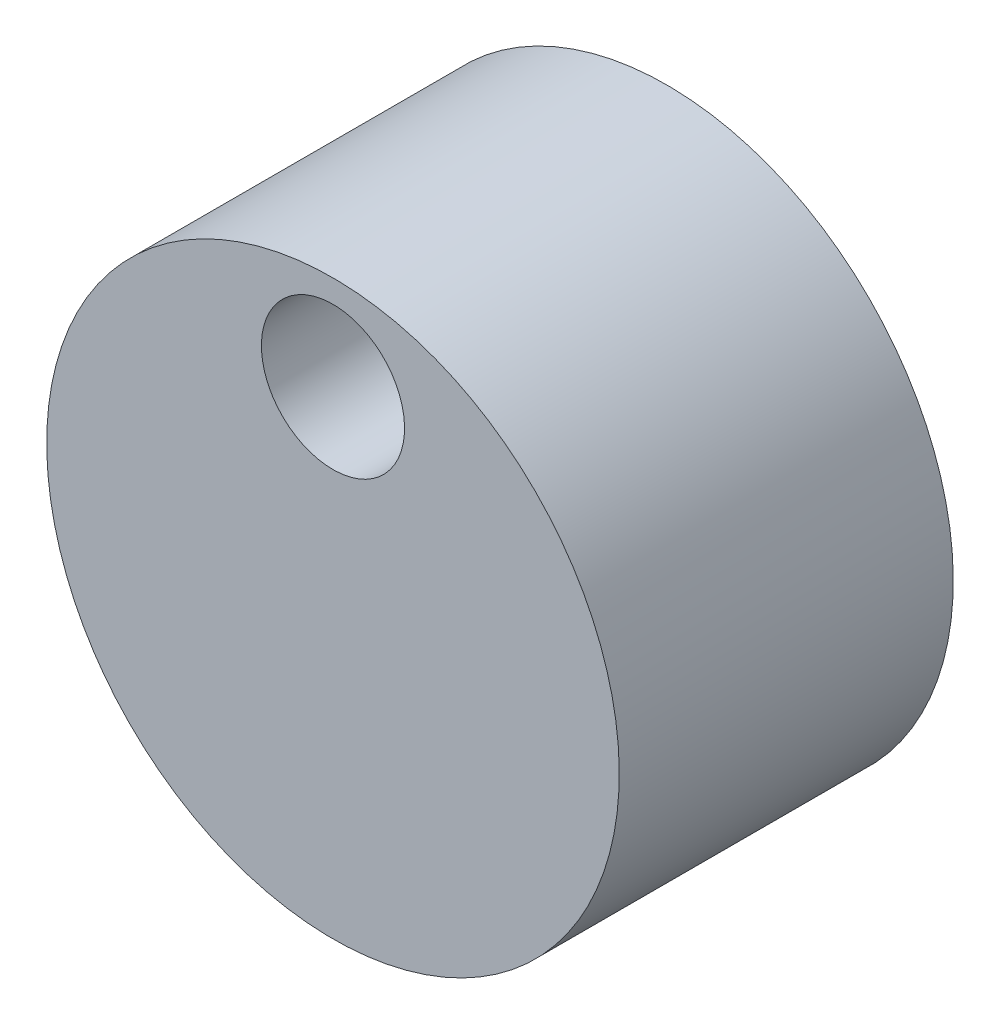
ISO-10303-21;
HEADER;
FILE_DESCRIPTION(('STEP AP214'),'2;1');
FILE_NAME('part.step','',(''),(''),'','','');
FILE_SCHEMA(('AUTOMOTIVE_DESIGN { 1 0 10303 214 1 1 1 1 }'));
ENDSEC;
DATA;
#1=APPLICATION_CONTEXT('core data for automotive mechanical design processes');
#2=APPLICATION_PROTOCOL_DEFINITION('international standard','automotive_design',2000,#1);
#3=PRODUCT_CONTEXT('',#1,'mechanical');
#4=PRODUCT('Part','Part','',(#3));
#5=PRODUCT_RELATED_PRODUCT_CATEGORY('part','',(#4));
#6=PRODUCT_DEFINITION_FORMATION('','',#4);
#7=PRODUCT_DEFINITION_CONTEXT('part definition',#1,'design');
#8=PRODUCT_DEFINITION('design','',#6,#7);
#9=PRODUCT_DEFINITION_SHAPE('','',#8);
#10=(LENGTH_UNIT() NAMED_UNIT(*) SI_UNIT(.MILLI.,.METRE.));
#11=(NAMED_UNIT(*) PLANE_ANGLE_UNIT() SI_UNIT($,.RADIAN.));
#12=(NAMED_UNIT(*) SI_UNIT($,.STERADIAN.) SOLID_ANGLE_UNIT());
#13=UNCERTAINTY_MEASURE_WITH_UNIT(LENGTH_MEASURE(1.E-05),#10,'distance_accuracy_value','');
#14=(GEOMETRIC_REPRESENTATION_CONTEXT(3) GLOBAL_UNCERTAINTY_ASSIGNED_CONTEXT((#13)) GLOBAL_UNIT_ASSIGNED_CONTEXT((#10,
#11,#12)) REPRESENTATION_CONTEXT('',''));
#15=CARTESIAN_POINT('',(0.,0.,0.));
#16=DIRECTION('',(0.,0.,1.));
#17=DIRECTION('',(1.,0.,0.));
#18=AXIS2_PLACEMENT_3D('',#15,#16,#17);
#19=CARTESIAN_POINT('',(0.,0.,14.81582));
#20=DIRECTION('',(0.,0.,1.));
#21=DIRECTION('',(1.,0.,0.));
#22=AXIS2_PLACEMENT_3D('',#19,#20,#21);
#23=PLANE('',#22);
#24=CARTESIAN_POINT('',(0.,0.,14.81582));
#25=DIRECTION('',(0.,0.,1.));
#26=DIRECTION('',(-0.75885671020465,-0.651257624429362,0.));
#27=AXIS2_PLACEMENT_3D('',#24,#25,#26);
#28=ELLIPSE('',#27,12.7,12.7);
#29=CARTESIAN_POINT('',(-9.63748021959905,-8.2709718302529,14.81582));
#30=VERTEX_POINT('',#29);
#31=EDGE_CURVE('E10',#30,#30,#28,.T.);
#32=ORIENTED_EDGE('',*,*,#31,.T.);
#33=EDGE_LOOP('',(#32));
#34=FACE_BOUND('',#33,.T.);
#35=CARTESIAN_POINT('',(0.,8.509,14.81582));
#36=DIRECTION('',(0.,0.,1.));
#37=DIRECTION('',(-0.841153784517993,-0.540795997388162,0.));
#38=AXIS2_PLACEMENT_3D('',#35,#36,#37);
#39=ELLIPSE('',#38,3.175,3.175);
#40=CARTESIAN_POINT('',(-2.67066326584463,6.79197270829259,14.81582));
#41=VERTEX_POINT('',#40);
#42=EDGE_CURVE('E41',#41,#41,#39,.T.);
#43=ORIENTED_EDGE('',*,*,#42,.F.);
#44=EDGE_LOOP('',(#43));
#45=FACE_BOUND('',#44,.T.);
#46=ADVANCED_FACE('F30',(#34,#45),#23,.T.);
#47=CARTESIAN_POINT('',(0.,0.,0.));
#48=DIRECTION('',(0.,0.,1.));
#49=DIRECTION('',(1.,0.,0.));
#50=AXIS2_PLACEMENT_3D('',#47,#48,#49);
#51=PLANE('',#50);
#52=CARTESIAN_POINT('',(0.,0.,0.));
#53=DIRECTION('',(0.,0.,1.));
#54=DIRECTION('',(-0.75885671020465,-0.651257624429362,0.));
#55=AXIS2_PLACEMENT_3D('',#52,#53,#54);
#56=ELLIPSE('',#55,12.7,12.7);
#57=CARTESIAN_POINT('',(-9.63748021959905,-8.2709718302529,0.));
#58=VERTEX_POINT('',#57);
#59=EDGE_CURVE('E35',#58,#58,#56,.T.);
#60=ORIENTED_EDGE('',*,*,#59,.F.);
#61=EDGE_LOOP('',(#60));
#62=FACE_BOUND('',#61,.T.);
#63=CARTESIAN_POINT('',(0.,8.509,0.));
#64=DIRECTION('',(0.,0.,1.));
#65=DIRECTION('',(-0.841153784517993,-0.540795997388162,0.));
#66=AXIS2_PLACEMENT_3D('',#63,#64,#65);
#67=ELLIPSE('',#66,3.175,3.175);
#68=CARTESIAN_POINT('',(-2.67066326584463,6.79197270829259,0.));
#69=VERTEX_POINT('',#68);
#70=EDGE_CURVE('E44',#69,#69,#67,.T.);
#71=ORIENTED_EDGE('',*,*,#70,.T.);
#72=EDGE_LOOP('',(#71));
#73=FACE_BOUND('',#72,.T.);
#74=ADVANCED_FACE('F55',(#62,#73),#51,.F.);
#75=DIRECTION('',(0.,0.,-1.));
#76=VECTOR('',#75,1.);
#77=SURFACE_OF_LINEAR_EXTRUSION('',#28,#76);
#78=ORIENTED_EDGE('',*,*,#31,.F.);
#79=EDGE_LOOP('',(#78));
#80=FACE_BOUND('',#79,.T.);
#81=ORIENTED_EDGE('',*,*,#59,.T.);
#82=EDGE_LOOP('',(#81));
#83=FACE_BOUND('',#82,.T.);
#84=ADVANCED_FACE('F32',(#80,#83),#77,.F.);
#85=DIRECTION('',(0.,0.,-1.));
#86=VECTOR('',#85,1.);
#87=SURFACE_OF_LINEAR_EXTRUSION('',#39,#86);
#88=ORIENTED_EDGE('',*,*,#42,.T.);
#89=EDGE_LOOP('',(#88));
#90=FACE_BOUND('',#89,.T.);
#91=ORIENTED_EDGE('',*,*,#70,.F.);
#92=EDGE_LOOP('',(#91));
#93=FACE_BOUND('',#92,.T.);
#94=ADVANCED_FACE('F50',(#90,#93),#87,.T.);
#95=CLOSED_SHELL('',(#46,#74,#84,#94));
#96=MANIFOLD_SOLID_BREP('B2',#95);
#97=ADVANCED_BREP_SHAPE_REPRESENTATION('',(#18,#96),#14);
#98=SHAPE_DEFINITION_REPRESENTATION(#9,#97);
ENDSEC;
END-ISO-10303-21;
